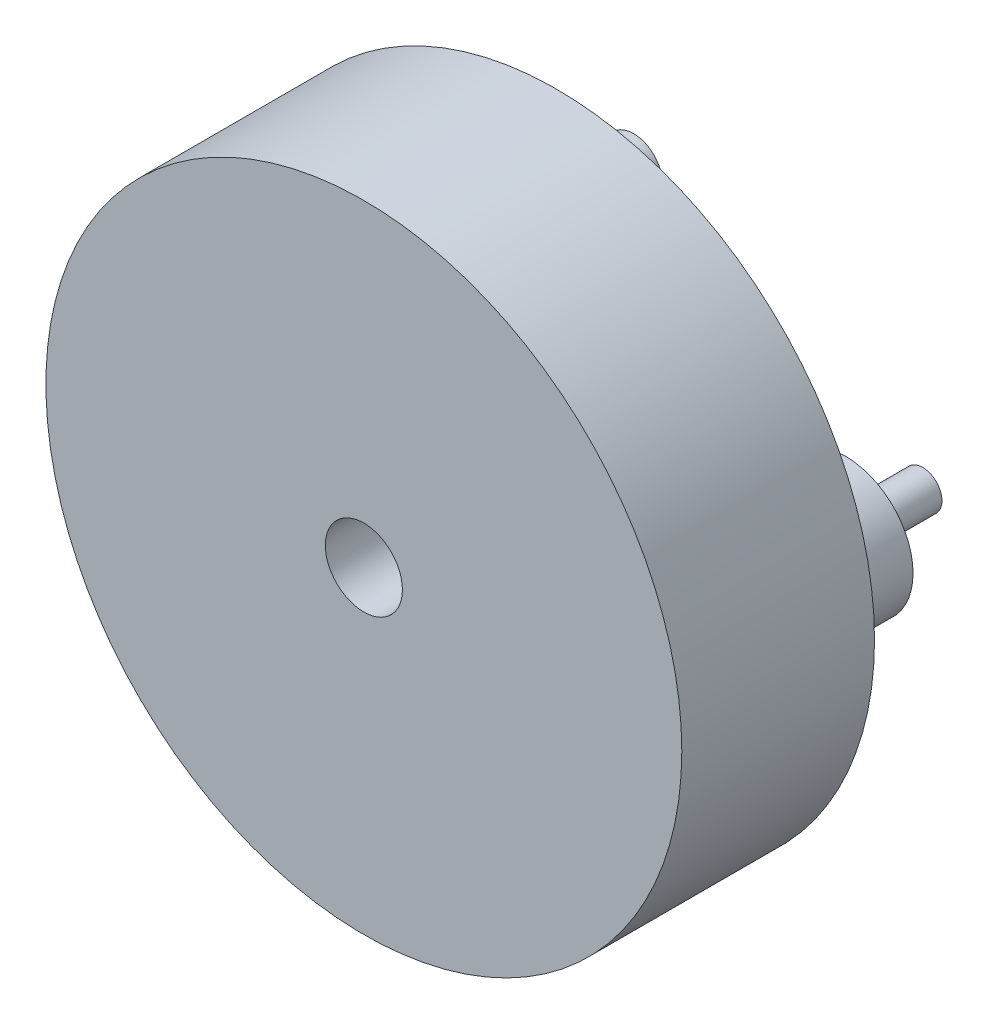
ISO-10303-21;
HEADER;
FILE_DESCRIPTION(('STEP AP214'),'2;1');
FILE_NAME('part.step','',(''),(''),'','','');
FILE_SCHEMA(('AUTOMOTIVE_DESIGN { 1 0 10303 214 1 1 1 1 }'));
ENDSEC;
DATA;
#1=APPLICATION_CONTEXT('core data for automotive mechanical design processes');
#2=APPLICATION_PROTOCOL_DEFINITION('international standard','automotive_design',2000,#1);
#3=PRODUCT_CONTEXT('',#1,'mechanical');
#4=PRODUCT('Part','Part','',(#3));
#5=PRODUCT_RELATED_PRODUCT_CATEGORY('part','',(#4));
#6=PRODUCT_DEFINITION_FORMATION('','',#4);
#7=PRODUCT_DEFINITION_CONTEXT('part definition',#1,'design');
#8=PRODUCT_DEFINITION('design','',#6,#7);
#9=PRODUCT_DEFINITION_SHAPE('','',#8);
#10=(LENGTH_UNIT() NAMED_UNIT(*) SI_UNIT(.MILLI.,.METRE.));
#11=(NAMED_UNIT(*) PLANE_ANGLE_UNIT() SI_UNIT($,.RADIAN.));
#12=(NAMED_UNIT(*) SI_UNIT($,.STERADIAN.) SOLID_ANGLE_UNIT());
#13=UNCERTAINTY_MEASURE_WITH_UNIT(LENGTH_MEASURE(1.E-05),#10,'distance_accuracy_value','');
#14=(GEOMETRIC_REPRESENTATION_CONTEXT(3) GLOBAL_UNCERTAINTY_ASSIGNED_CONTEXT((#13)) GLOBAL_UNIT_ASSIGNED_CONTEXT((#10,
#11,#12)) REPRESENTATION_CONTEXT('',''));
#15=CARTESIAN_POINT('',(0.,0.,0.));
#16=DIRECTION('',(0.,0.,1.));
#17=DIRECTION('',(1.,0.,0.));
#18=AXIS2_PLACEMENT_3D('',#15,#16,#17);
#19=CARTESIAN_POINT('',(0.,0.,5.));
#20=DIRECTION('',(0.,0.,-1.));
#21=DIRECTION('',(-1.,0.,0.));
#22=AXIS2_PLACEMENT_3D('',#19,#20,#21);
#23=CYLINDRICAL_SURFACE('',#22,8.25);
#24=CARTESIAN_POINT('',(0.,0.,5.));
#25=DIRECTION('',(0.,0.,1.));
#26=DIRECTION('',(1.,0.,0.));
#27=AXIS2_PLACEMENT_3D('',#24,#25,#26);
#28=CIRCLE('',#27,8.25);
#29=CARTESIAN_POINT('',(8.25,0.,5.));
#30=VERTEX_POINT('',#29);
#31=EDGE_CURVE('E73',#30,#30,#28,.T.);
#32=ORIENTED_EDGE('',*,*,#31,.F.);
#33=EDGE_LOOP('',(#32));
#34=FACE_BOUND('',#33,.T.);
#35=CARTESIAN_POINT('',(0.,0.,0.));
#36=DIRECTION('',(0.,0.,1.));
#37=DIRECTION('',(1.,0.,0.));
#38=AXIS2_PLACEMENT_3D('',#35,#36,#37);
#39=CIRCLE('',#38,8.25);
#40=CARTESIAN_POINT('',(8.25,0.,0.));
#41=VERTEX_POINT('',#40);
#42=EDGE_CURVE('E70',#41,#41,#39,.T.);
#43=ORIENTED_EDGE('',*,*,#42,.T.);
#44=EDGE_LOOP('',(#43));
#45=FACE_BOUND('',#44,.T.);
#46=ADVANCED_FACE('F35',(#34,#45),#23,.T.);
#47=CARTESIAN_POINT('',(0.,0.,5.));
#48=DIRECTION('',(0.,0.,1.));
#49=DIRECTION('',(1.,0.,0.));
#50=AXIS2_PLACEMENT_3D('',#47,#48,#49);
#51=PLANE('',#50);
#52=CARTESIAN_POINT('',(0.,0.,5.));
#53=DIRECTION('',(0.,0.,1.));
#54=DIRECTION('',(1.,0.,0.));
#55=AXIS2_PLACEMENT_3D('',#52,#53,#54);
#56=CIRCLE('',#55,1.);
#57=CARTESIAN_POINT('',(1.,0.,5.));
#58=VERTEX_POINT('',#57);
#59=EDGE_CURVE('E66',#58,#58,#56,.T.);
#60=ORIENTED_EDGE('',*,*,#59,.F.);
#61=EDGE_LOOP('',(#60));
#62=FACE_BOUND('',#61,.T.);
#63=ORIENTED_EDGE('',*,*,#31,.T.);
#64=EDGE_LOOP('',(#63));
#65=FACE_BOUND('',#64,.T.);
#66=ADVANCED_FACE('F96',(#62,#65),#51,.T.);
#67=CARTESIAN_POINT('',(0.,0.,0.));
#68=DIRECTION('',(0.,0.,1.));
#69=DIRECTION('',(1.,0.,0.));
#70=AXIS2_PLACEMENT_3D('',#67,#68,#69);
#71=PLANE('',#70);
#72=CARTESIAN_POINT('',(0.,-5.5,0.));
#73=DIRECTION('',(0.,0.,1.));
#74=DIRECTION('',(1.,0.,0.));
#75=AXIS2_PLACEMENT_3D('',#72,#73,#74);
#76=CIRCLE('',#75,0.75);
#77=CARTESIAN_POINT('',(0.75,-5.5,0.));
#78=VERTEX_POINT('',#77);
#79=EDGE_CURVE('E38',#78,#78,#76,.F.);
#80=ORIENTED_EDGE('',*,*,#79,.F.);
#81=EDGE_LOOP('',(#80));
#82=FACE_BOUND('',#81,.T.);
#83=CARTESIAN_POINT('',(0.,5.5,0.));
#84=DIRECTION('',(0.,0.,1.));
#85=DIRECTION('',(1.,0.,0.));
#86=AXIS2_PLACEMENT_3D('',#83,#84,#85);
#87=CIRCLE('',#86,0.75);
#88=CARTESIAN_POINT('',(0.75,5.5,0.));
#89=VERTEX_POINT('',#88);
#90=EDGE_CURVE('E83',#89,#89,#87,.F.);
#91=ORIENTED_EDGE('',*,*,#90,.F.);
#92=EDGE_LOOP('',(#91));
#93=FACE_BOUND('',#92,.T.);
#94=CARTESIAN_POINT('',(-5.5,0.,0.));
#95=DIRECTION('',(0.,0.,1.));
#96=DIRECTION('',(1.,0.,0.));
#97=AXIS2_PLACEMENT_3D('',#94,#95,#96);
#98=CIRCLE('',#97,1.75);
#99=CARTESIAN_POINT('',(-3.75,0.,0.));
#100=VERTEX_POINT('',#99);
#101=EDGE_CURVE('E81',#100,#100,#98,.F.);
#102=ORIENTED_EDGE('',*,*,#101,.F.);
#103=EDGE_LOOP('',(#102));
#104=FACE_BOUND('',#103,.T.);
#105=CARTESIAN_POINT('',(5.5,0.,0.));
#106=DIRECTION('',(0.,0.,1.));
#107=DIRECTION('',(1.,0.,0.));
#108=AXIS2_PLACEMENT_3D('',#105,#106,#107);
#109=CIRCLE('',#108,1.75);
#110=CARTESIAN_POINT('',(7.25,0.,0.));
#111=VERTEX_POINT('',#110);
#112=EDGE_CURVE('E76',#111,#111,#109,.F.);
#113=ORIENTED_EDGE('',*,*,#112,.F.);
#114=EDGE_LOOP('',(#113));
#115=FACE_BOUND('',#114,.T.);
#116=ORIENTED_EDGE('',*,*,#42,.F.);
#117=EDGE_LOOP('',(#116));
#118=FACE_BOUND('',#117,.T.);
#119=ADVANCED_FACE('F92',(#82,#93,#104,#115,#118),#71,.F.);
#120=CARTESIAN_POINT('',(0.,0.,3.));
#121=DIRECTION('',(0.,0.,1.));
#122=DIRECTION('',(1.,0.,0.));
#123=AXIS2_PLACEMENT_3D('',#120,#121,#122);
#124=CYLINDRICAL_SURFACE('',#123,1.);
#125=CARTESIAN_POINT('',(0.,0.,3.));
#126=DIRECTION('',(0.,0.,1.));
#127=DIRECTION('',(1.,0.,0.));
#128=AXIS2_PLACEMENT_3D('',#125,#126,#127);
#129=CIRCLE('',#128,1.);
#130=CARTESIAN_POINT('',(1.,0.,3.));
#131=VERTEX_POINT('',#130);
#132=EDGE_CURVE('E67',#131,#131,#129,.T.);
#133=ORIENTED_EDGE('',*,*,#132,.F.);
#134=EDGE_LOOP('',(#133));
#135=FACE_BOUND('',#134,.T.);
#136=ORIENTED_EDGE('',*,*,#59,.T.);
#137=EDGE_LOOP('',(#136));
#138=FACE_BOUND('',#137,.T.);
#139=ADVANCED_FACE('F95',(#135,#138),#124,.F.);
#140=CARTESIAN_POINT('',(0.,0.,3.));
#141=DIRECTION('',(0.,0.,1.));
#142=DIRECTION('',(1.,0.,0.));
#143=AXIS2_PLACEMENT_3D('',#140,#141,#142);
#144=PLANE('',#143);
#145=ORIENTED_EDGE('',*,*,#132,.T.);
#146=EDGE_LOOP('',(#145));
#147=FACE_BOUND('',#146,.T.);
#148=ADVANCED_FACE('F119',(#147),#144,.T.);
#149=CARTESIAN_POINT('',(5.5,0.,-2.));
#150=DIRECTION('',(0.,0.,1.));
#151=DIRECTION('',(1.,0.,0.));
#152=AXIS2_PLACEMENT_3D('',#149,#150,#151);
#153=CYLINDRICAL_SURFACE('',#152,1.75);
#154=CARTESIAN_POINT('',(5.5,0.,-2.));
#155=DIRECTION('',(0.,0.,-1.));
#156=DIRECTION('',(-1.,0.,0.));
#157=AXIS2_PLACEMENT_3D('',#154,#155,#156);
#158=CIRCLE('',#157,1.75);
#159=CARTESIAN_POINT('',(3.75,0.,-2.));
#160=VERTEX_POINT('',#159);
#161=EDGE_CURVE('E63',#160,#160,#158,.T.);
#162=ORIENTED_EDGE('',*,*,#161,.F.);
#163=EDGE_LOOP('',(#162));
#164=FACE_BOUND('',#163,.T.);
#165=ORIENTED_EDGE('',*,*,#112,.T.);
#166=EDGE_LOOP('',(#165));
#167=FACE_BOUND('',#166,.T.);
#168=ADVANCED_FACE('F123',(#164,#167),#153,.T.);
#169=CARTESIAN_POINT('',(5.5,0.,-2.));
#170=DIRECTION('',(0.,0.,-1.));
#171=DIRECTION('',(-1.,0.,0.));
#172=AXIS2_PLACEMENT_3D('',#169,#170,#171);
#173=PLANE('',#172);
#174=CARTESIAN_POINT('',(5.5,0.,-2.));
#175=DIRECTION('',(0.,0.,-1.));
#176=DIRECTION('',(-1.,0.,0.));
#177=AXIS2_PLACEMENT_3D('',#174,#175,#176);
#178=CIRCLE('',#177,0.500000000000001);
#179=CARTESIAN_POINT('',(5.,0.,-2.));
#180=VERTEX_POINT('',#179);
#181=EDGE_CURVE('E42',#180,#180,#178,.T.);
#182=ORIENTED_EDGE('',*,*,#181,.F.);
#183=EDGE_LOOP('',(#182));
#184=FACE_BOUND('',#183,.T.);
#185=ORIENTED_EDGE('',*,*,#161,.T.);
#186=EDGE_LOOP('',(#185));
#187=FACE_BOUND('',#186,.T.);
#188=ADVANCED_FACE('F127',(#184,#187),#173,.T.);
#189=CARTESIAN_POINT('',(-5.5,0.,-2.));
#190=DIRECTION('',(0.,0.,1.));
#191=DIRECTION('',(1.,0.,0.));
#192=AXIS2_PLACEMENT_3D('',#189,#190,#191);
#193=CYLINDRICAL_SURFACE('',#192,1.75);
#194=CARTESIAN_POINT('',(-5.5,0.,-2.));
#195=DIRECTION('',(0.,0.,-1.));
#196=DIRECTION('',(-1.,0.,0.));
#197=AXIS2_PLACEMENT_3D('',#194,#195,#196);
#198=CIRCLE('',#197,1.75);
#199=CARTESIAN_POINT('',(-7.25,0.,-2.));
#200=VERTEX_POINT('',#199);
#201=EDGE_CURVE('E60',#200,#200,#198,.T.);
#202=ORIENTED_EDGE('',*,*,#201,.F.);
#203=EDGE_LOOP('',(#202));
#204=FACE_BOUND('',#203,.T.);
#205=ORIENTED_EDGE('',*,*,#101,.T.);
#206=EDGE_LOOP('',(#205));
#207=FACE_BOUND('',#206,.T.);
#208=ADVANCED_FACE('F131',(#204,#207),#193,.T.);
#209=CARTESIAN_POINT('',(-5.5,0.,-2.));
#210=DIRECTION('',(0.,0.,-1.));
#211=DIRECTION('',(-1.,0.,0.));
#212=AXIS2_PLACEMENT_3D('',#209,#210,#211);
#213=PLANE('',#212);
#214=CARTESIAN_POINT('',(-5.5,0.,-2.));
#215=DIRECTION('',(0.,0.,-1.));
#216=DIRECTION('',(-1.,0.,0.));
#217=AXIS2_PLACEMENT_3D('',#214,#215,#216);
#218=CIRCLE('',#217,0.500000000000001);
#219=CARTESIAN_POINT('',(-6.,0.,-2.));
#220=VERTEX_POINT('',#219);
#221=EDGE_CURVE('E10',#220,#220,#218,.T.);
#222=ORIENTED_EDGE('',*,*,#221,.F.);
#223=EDGE_LOOP('',(#222));
#224=FACE_BOUND('',#223,.T.);
#225=ORIENTED_EDGE('',*,*,#201,.T.);
#226=EDGE_LOOP('',(#225));
#227=FACE_BOUND('',#226,.T.);
#228=ADVANCED_FACE('F135',(#224,#227),#213,.T.);
#229=CARTESIAN_POINT('',(0.,5.5,-2.));
#230=DIRECTION('',(0.,0.,1.));
#231=DIRECTION('',(1.,0.,0.));
#232=AXIS2_PLACEMENT_3D('',#229,#230,#231);
#233=CYLINDRICAL_SURFACE('',#232,0.75);
#234=CARTESIAN_POINT('',(0.,5.5,-2.));
#235=DIRECTION('',(0.,0.,-1.));
#236=DIRECTION('',(-1.,0.,0.));
#237=AXIS2_PLACEMENT_3D('',#234,#235,#236);
#238=CIRCLE('',#237,0.75);
#239=CARTESIAN_POINT('',(-0.75,5.5,-2.));
#240=VERTEX_POINT('',#239);
#241=EDGE_CURVE('E57',#240,#240,#238,.T.);
#242=ORIENTED_EDGE('',*,*,#241,.F.);
#243=EDGE_LOOP('',(#242));
#244=FACE_BOUND('',#243,.T.);
#245=ORIENTED_EDGE('',*,*,#90,.T.);
#246=EDGE_LOOP('',(#245));
#247=FACE_BOUND('',#246,.T.);
#248=ADVANCED_FACE('F139',(#244,#247),#233,.T.);
#249=CARTESIAN_POINT('',(0.,5.5,-2.));
#250=DIRECTION('',(0.,0.,-1.));
#251=DIRECTION('',(-1.,0.,0.));
#252=AXIS2_PLACEMENT_3D('',#249,#250,#251);
#253=PLANE('',#252);
#254=ORIENTED_EDGE('',*,*,#241,.T.);
#255=EDGE_LOOP('',(#254));
#256=FACE_BOUND('',#255,.T.);
#257=ADVANCED_FACE('F143',(#256),#253,.T.);
#258=CARTESIAN_POINT('',(0.,-5.5,-2.));
#259=DIRECTION('',(0.,0.,1.));
#260=DIRECTION('',(1.,0.,0.));
#261=AXIS2_PLACEMENT_3D('',#258,#259,#260);
#262=CYLINDRICAL_SURFACE('',#261,0.75);
#263=CARTESIAN_POINT('',(0.,-5.5,-2.));
#264=DIRECTION('',(0.,0.,-1.));
#265=DIRECTION('',(-1.,0.,0.));
#266=AXIS2_PLACEMENT_3D('',#263,#264,#265);
#267=CIRCLE('',#266,0.75);
#268=CARTESIAN_POINT('',(-0.75,-5.5,-2.));
#269=VERTEX_POINT('',#268);
#270=EDGE_CURVE('E53',#269,#269,#267,.T.);
#271=ORIENTED_EDGE('',*,*,#270,.F.);
#272=EDGE_LOOP('',(#271));
#273=FACE_BOUND('',#272,.T.);
#274=ORIENTED_EDGE('',*,*,#79,.T.);
#275=EDGE_LOOP('',(#274));
#276=FACE_BOUND('',#275,.T.);
#277=ADVANCED_FACE('F90',(#273,#276),#262,.T.);
#278=CARTESIAN_POINT('',(0.,-5.5,-2.));
#279=DIRECTION('',(0.,0.,-1.));
#280=DIRECTION('',(-1.,0.,0.));
#281=AXIS2_PLACEMENT_3D('',#278,#279,#280);
#282=PLANE('',#281);
#283=ORIENTED_EDGE('',*,*,#270,.T.);
#284=EDGE_LOOP('',(#283));
#285=FACE_BOUND('',#284,.T.);
#286=ADVANCED_FACE('F150',(#285),#282,.T.);
#287=CARTESIAN_POINT('',(5.5,0.,-4.));
#288=DIRECTION('',(0.,0.,1.));
#289=DIRECTION('',(1.,0.,0.));
#290=AXIS2_PLACEMENT_3D('',#287,#288,#289);
#291=CYLINDRICAL_SURFACE('',#290,0.500000000000001);
#292=CARTESIAN_POINT('',(5.5,0.,-4.));
#293=DIRECTION('',(0.,0.,-1.));
#294=DIRECTION('',(-1.,0.,0.));
#295=AXIS2_PLACEMENT_3D('',#292,#293,#294);
#296=CIRCLE('',#295,0.500000000000001);
#297=CARTESIAN_POINT('',(5.,0.,-4.));
#298=VERTEX_POINT('',#297);
#299=EDGE_CURVE('E51',#298,#298,#296,.T.);
#300=ORIENTED_EDGE('',*,*,#299,.F.);
#301=EDGE_LOOP('',(#300));
#302=FACE_BOUND('',#301,.T.);
#303=ORIENTED_EDGE('',*,*,#181,.T.);
#304=EDGE_LOOP('',(#303));
#305=FACE_BOUND('',#304,.T.);
#306=ADVANCED_FACE('F154',(#302,#305),#291,.T.);
#307=CARTESIAN_POINT('',(5.5,0.,-4.));
#308=DIRECTION('',(0.,0.,-1.));
#309=DIRECTION('',(-1.,0.,0.));
#310=AXIS2_PLACEMENT_3D('',#307,#308,#309);
#311=PLANE('',#310);
#312=ORIENTED_EDGE('',*,*,#299,.T.);
#313=EDGE_LOOP('',(#312));
#314=FACE_BOUND('',#313,.T.);
#315=ADVANCED_FACE('F158',(#314),#311,.T.);
#316=CARTESIAN_POINT('',(-5.5,0.,-4.));
#317=DIRECTION('',(0.,0.,1.));
#318=DIRECTION('',(1.,0.,0.));
#319=AXIS2_PLACEMENT_3D('',#316,#317,#318);
#320=CYLINDRICAL_SURFACE('',#319,0.500000000000001);
#321=CARTESIAN_POINT('',(-5.5,0.,-4.));
#322=DIRECTION('',(0.,0.,-1.));
#323=DIRECTION('',(-1.,0.,0.));
#324=AXIS2_PLACEMENT_3D('',#321,#322,#323);
#325=CIRCLE('',#324,0.500000000000001);
#326=CARTESIAN_POINT('',(-6.,0.,-4.));
#327=VERTEX_POINT('',#326);
#328=EDGE_CURVE('E50',#327,#327,#325,.T.);
#329=ORIENTED_EDGE('',*,*,#328,.F.);
#330=EDGE_LOOP('',(#329));
#331=FACE_BOUND('',#330,.T.);
#332=ORIENTED_EDGE('',*,*,#221,.T.);
#333=EDGE_LOOP('',(#332));
#334=FACE_BOUND('',#333,.T.);
#335=ADVANCED_FACE('F162',(#331,#334),#320,.T.);
#336=CARTESIAN_POINT('',(-5.5,0.,-4.));
#337=DIRECTION('',(0.,0.,-1.));
#338=DIRECTION('',(-1.,0.,0.));
#339=AXIS2_PLACEMENT_3D('',#336,#337,#338);
#340=PLANE('',#339);
#341=ORIENTED_EDGE('',*,*,#328,.T.);
#342=EDGE_LOOP('',(#341));
#343=FACE_BOUND('',#342,.T.);
#344=ADVANCED_FACE('F166',(#343),#340,.T.);
#345=CLOSED_SHELL('',(#46,#66,#119,#139,#148,#168,#188,#208,#228,#248,#257,#277,#286,#306,#315,
#335,#344));
#346=MANIFOLD_SOLID_BREP('B2',#345);
#347=ADVANCED_BREP_SHAPE_REPRESENTATION('',(#18,#346),#14);
#348=SHAPE_DEFINITION_REPRESENTATION(#9,#347);
ENDSEC;
END-ISO-10303-21;
